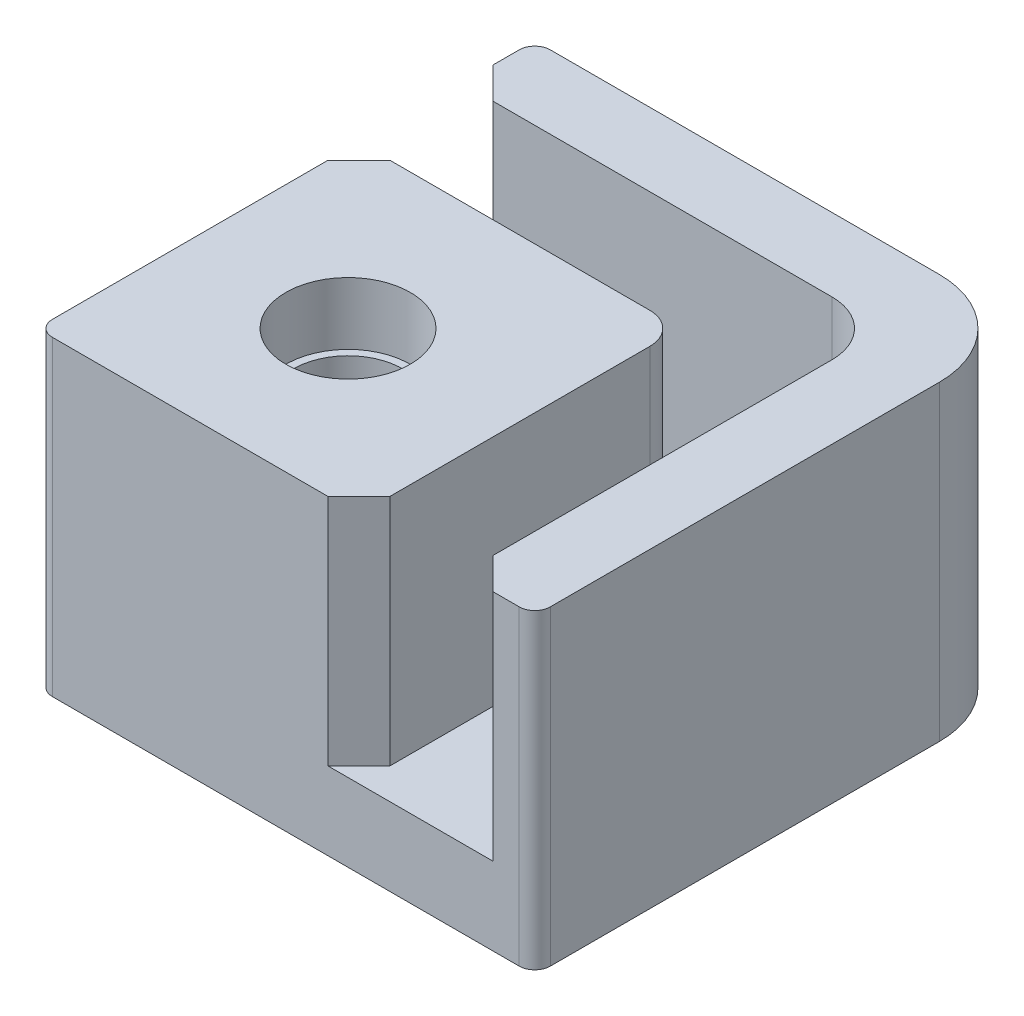
ISO-10303-21;
HEADER;
FILE_DESCRIPTION(('STEP AP214'),'2;1');
FILE_NAME('part.step','',(''),(''),'','','');
FILE_SCHEMA(('AUTOMOTIVE_DESIGN { 1 0 10303 214 1 1 1 1 }'));
ENDSEC;
DATA;
#1=APPLICATION_CONTEXT('core data for automotive mechanical design processes');
#2=APPLICATION_PROTOCOL_DEFINITION('international standard','automotive_design',2000,#1);
#3=PRODUCT_CONTEXT('',#1,'mechanical');
#4=PRODUCT('Part','Part','',(#3));
#5=PRODUCT_RELATED_PRODUCT_CATEGORY('part','',(#4));
#6=PRODUCT_DEFINITION_FORMATION('','',#4);
#7=PRODUCT_DEFINITION_CONTEXT('part definition',#1,'design');
#8=PRODUCT_DEFINITION('design','',#6,#7);
#9=PRODUCT_DEFINITION_SHAPE('','',#8);
#10=(LENGTH_UNIT() NAMED_UNIT(*) SI_UNIT(.MILLI.,.METRE.));
#11=(NAMED_UNIT(*) PLANE_ANGLE_UNIT() SI_UNIT($,.RADIAN.));
#12=(NAMED_UNIT(*) SI_UNIT($,.STERADIAN.) SOLID_ANGLE_UNIT());
#13=UNCERTAINTY_MEASURE_WITH_UNIT(LENGTH_MEASURE(1.E-05),#10,'distance_accuracy_value','');
#14=(GEOMETRIC_REPRESENTATION_CONTEXT(3) GLOBAL_UNCERTAINTY_ASSIGNED_CONTEXT((#13)) GLOBAL_UNIT_ASSIGNED_CONTEXT((#10,
#11,#12)) REPRESENTATION_CONTEXT('',''));
#15=CARTESIAN_POINT('',(0.,0.,0.));
#16=DIRECTION('',(0.,0.,1.));
#17=DIRECTION('',(1.,0.,0.));
#18=AXIS2_PLACEMENT_3D('',#15,#16,#17);
#19=CARTESIAN_POINT('',(5.,0.,11.));
#20=DIRECTION('',(0.,1.,0.));
#21=DIRECTION('',(0.,0.,1.));
#22=AXIS2_PLACEMENT_3D('',#19,#20,#21);
#23=CYLINDRICAL_SURFACE('',#22,1.75);
#24=CARTESIAN_POINT('',(5.,0.,11.));
#25=DIRECTION('',(0.,1.,0.));
#26=DIRECTION('',(0.,0.,1.));
#27=AXIS2_PLACEMENT_3D('',#24,#25,#26);
#28=CIRCLE('',#27,1.75);
#29=CARTESIAN_POINT('',(5.,0.,12.75));
#30=VERTEX_POINT('',#29);
#31=EDGE_CURVE('E212',#30,#30,#28,.T.);
#32=ORIENTED_EDGE('',*,*,#31,.F.);
#33=EDGE_LOOP('',(#32));
#34=FACE_BOUND('',#33,.T.);
#35=CARTESIAN_POINT('',(5.,8.,11.));
#36=DIRECTION('',(0.,1.,0.));
#37=DIRECTION('',(0.,0.,1.));
#38=AXIS2_PLACEMENT_3D('',#35,#36,#37);
#39=CIRCLE('',#38,1.75);
#40=CARTESIAN_POINT('',(5.,8.,12.75));
#41=VERTEX_POINT('',#40);
#42=EDGE_CURVE('E40',#41,#41,#39,.F.);
#43=ORIENTED_EDGE('',*,*,#42,.F.);
#44=EDGE_LOOP('',(#43));
#45=FACE_BOUND('',#44,.T.);
#46=ADVANCED_FACE('F36',(#34,#45),#23,.F.);
#47=CARTESIAN_POINT('',(0.,10.,16.));
#48=DIRECTION('',(0.,1.,0.));
#49=DIRECTION('',(0.,0.,1.));
#50=AXIS2_PLACEMENT_3D('',#47,#48,#49);
#51=PLANE('',#50);
#52=DIRECTION('',(1.,0.,0.));
#53=VECTOR('',#52,1.);
#54=CARTESIAN_POINT('',(0.,10.,16.));
#55=LINE('',#54,#53);
#56=CARTESIAN_POINT('',(14.65,10.,16.));
#57=VERTEX_POINT('',#56);
#58=CARTESIAN_POINT('',(15.5,10.,16.));
#59=VERTEX_POINT('',#58);
#60=EDGE_CURVE('E219',#57,#59,#55,.T.);
#61=ORIENTED_EDGE('',*,*,#60,.T.);
#62=CARTESIAN_POINT('',(15.5,10.,15.5));
#63=DIRECTION('',(0.,1.,0.));
#64=DIRECTION('',(0.,0.,1.));
#65=AXIS2_PLACEMENT_3D('',#62,#63,#64);
#66=CIRCLE('',#65,0.5);
#67=CARTESIAN_POINT('',(16.,10.,15.5));
#68=VERTEX_POINT('',#67);
#69=EDGE_CURVE('E314',#59,#68,#66,.T.);
#70=ORIENTED_EDGE('',*,*,#69,.T.);
#71=DIRECTION('',(0.,0.,-1.));
#72=VECTOR('',#71,1.);
#73=CARTESIAN_POINT('',(16.,10.,0.));
#74=LINE('',#73,#72);
#75=CARTESIAN_POINT('',(16.,10.,3.));
#76=VERTEX_POINT('',#75);
#77=EDGE_CURVE('E223',#68,#76,#74,.T.);
#78=ORIENTED_EDGE('',*,*,#77,.T.);
#79=CARTESIAN_POINT('',(13.,10.,3.));
#80=DIRECTION('',(0.,1.,0.));
#81=DIRECTION('',(0.,0.,1.));
#82=AXIS2_PLACEMENT_3D('',#79,#80,#81);
#83=CIRCLE('',#82,3.);
#84=CARTESIAN_POINT('',(13.,10.,0.));
#85=VERTEX_POINT('',#84);
#86=EDGE_CURVE('E258',#76,#85,#83,.T.);
#87=ORIENTED_EDGE('',*,*,#86,.T.);
#88=DIRECTION('',(-1.,0.,0.));
#89=VECTOR('',#88,1.);
#90=CARTESIAN_POINT('',(0.,10.,0.));
#91=LINE('',#90,#89);
#92=CARTESIAN_POINT('',(0.5,10.,0.));
#93=VERTEX_POINT('',#92);
#94=EDGE_CURVE('E196',#85,#93,#91,.T.);
#95=ORIENTED_EDGE('',*,*,#94,.T.);
#96=CARTESIAN_POINT('',(0.5,10.,0.5));
#97=DIRECTION('',(0.,1.,0.));
#98=DIRECTION('',(0.,0.,1.));
#99=AXIS2_PLACEMENT_3D('',#96,#97,#98);
#100=CIRCLE('',#99,0.5);
#101=CARTESIAN_POINT('',(0.,10.,0.5));
#102=VERTEX_POINT('',#101);
#103=EDGE_CURVE('E60',#93,#102,#100,.T.);
#104=ORIENTED_EDGE('',*,*,#103,.T.);
#105=DIRECTION('',(0.,0.,1.));
#106=VECTOR('',#105,1.);
#107=CARTESIAN_POINT('',(0.,10.,0.));
#108=LINE('',#107,#106);
#109=CARTESIAN_POINT('',(0.,10.,1.35000000000001));
#110=VERTEX_POINT('',#109);
#111=EDGE_CURVE('E217',#102,#110,#108,.T.);
#112=ORIENTED_EDGE('',*,*,#111,.T.);
#113=DIRECTION('',(-0.70710678118655,0.,-0.707106781186545));
#114=VECTOR('',#113,1.);
#115=CARTESIAN_POINT('',(7.325,10.,8.67499999999995));
#116=LINE('',#115,#114);
#117=CARTESIAN_POINT('',(1.,10.,2.35));
#118=VERTEX_POINT('',#117);
#119=EDGE_CURVE('E274',#110,#118,#116,.F.);
#120=ORIENTED_EDGE('',*,*,#119,.T.);
#121=DIRECTION('',(-1.,0.,0.));
#122=VECTOR('',#121,1.);
#123=CARTESIAN_POINT('',(0.,10.,2.35));
#124=LINE('',#123,#122);
#125=CARTESIAN_POINT('',(11.9,10.,2.35));
#126=VERTEX_POINT('',#125);
#127=EDGE_CURVE('E204',#126,#118,#124,.T.);
#128=ORIENTED_EDGE('',*,*,#127,.F.);
#129=CARTESIAN_POINT('',(11.9,10.,4.1));
#130=DIRECTION('',(0.,1.,0.));
#131=DIRECTION('',(0.,0.,1.));
#132=AXIS2_PLACEMENT_3D('',#129,#130,#131);
#133=CIRCLE('',#132,1.75);
#134=CARTESIAN_POINT('',(13.65,10.,4.1));
#135=VERTEX_POINT('',#134);
#136=EDGE_CURVE('E246',#126,#135,#133,.F.);
#137=ORIENTED_EDGE('',*,*,#136,.T.);
#138=DIRECTION('',(0.,0.,-1.));
#139=VECTOR('',#138,1.);
#140=CARTESIAN_POINT('',(13.65,10.,16.));
#141=LINE('',#140,#139);
#142=CARTESIAN_POINT('',(13.65,10.,15.));
#143=VERTEX_POINT('',#142);
#144=EDGE_CURVE('E201',#143,#135,#141,.T.);
#145=ORIENTED_EDGE('',*,*,#144,.F.);
#146=DIRECTION('',(-0.70710678118655,0.,-0.707106781186545));
#147=VECTOR('',#146,1.);
#148=CARTESIAN_POINT('',(7.32499999999995,10.,8.675));
#149=LINE('',#148,#147);
#150=EDGE_CURVE('E276',#143,#57,#149,.F.);
#151=ORIENTED_EDGE('',*,*,#150,.T.);
#152=EDGE_LOOP('',(#61,#70,#78,#87,#95,#104,#112,#120,#128,#137,#145,#151));
#153=FACE_BOUND('',#152,.T.);
#154=ADVANCED_FACE('F357',(#153),#51,.T.);
#155=CARTESIAN_POINT('',(0.,10.,0.));
#156=DIRECTION('',(1.,0.,0.));
#157=DIRECTION('',(0.,0.,-1.));
#158=AXIS2_PLACEMENT_3D('',#155,#156,#157);
#159=PLANE('',#158);
#160=DIRECTION('',(0.,0.,1.));
#161=VECTOR('',#160,1.);
#162=CARTESIAN_POINT('',(0.,0.,0.));
#163=LINE('',#162,#161);
#164=CARTESIAN_POINT('',(0.,0.,0.5));
#165=VERTEX_POINT('',#164);
#166=CARTESIAN_POINT('',(0.,0.,15.5));
#167=VERTEX_POINT('',#166);
#168=EDGE_CURVE('E215',#165,#167,#163,.T.);
#169=ORIENTED_EDGE('',*,*,#168,.T.);
#170=DIRECTION('',(0.,-1.,0.));
#171=VECTOR('',#170,1.);
#172=CARTESIAN_POINT('',(0.,10.,15.5));
#173=LINE('',#172,#171);
#174=CARTESIAN_POINT('',(0.,10.,15.5));
#175=VERTEX_POINT('',#174);
#176=EDGE_CURVE('E52',#167,#175,#173,.F.);
#177=ORIENTED_EDGE('',*,*,#176,.T.);
#178=CARTESIAN_POINT('',(0.,10.,6.65));
#179=VERTEX_POINT('',#178);
#180=EDGE_CURVE('E220',#179,#175,#108,.T.);
#181=ORIENTED_EDGE('',*,*,#180,.F.);
#182=DIRECTION('',(0.,-1.,0.));
#183=VECTOR('',#182,1.);
#184=CARTESIAN_POINT('',(0.,10.,6.65));
#185=LINE('',#184,#183);
#186=CARTESIAN_POINT('',(0.,2.5,6.65));
#187=VERTEX_POINT('',#186);
#188=EDGE_CURVE('E284',#179,#187,#185,.T.);
#189=ORIENTED_EDGE('',*,*,#188,.T.);
#190=DIRECTION('',(0.,0.,1.));
#191=VECTOR('',#190,1.);
#192=CARTESIAN_POINT('',(0.,2.5,2.35));
#193=LINE('',#192,#191);
#194=CARTESIAN_POINT('',(0.,2.5,1.35000000000001));
#195=VERTEX_POINT('',#194);
#196=EDGE_CURVE('E211',#195,#187,#193,.T.);
#197=ORIENTED_EDGE('',*,*,#196,.F.);
#198=DIRECTION('',(0.,1.,0.));
#199=VECTOR('',#198,1.);
#200=CARTESIAN_POINT('',(0.,10.,1.35000000000001));
#201=LINE('',#200,#199);
#202=EDGE_CURVE('E281',#195,#110,#201,.T.);
#203=ORIENTED_EDGE('',*,*,#202,.T.);
#204=ORIENTED_EDGE('',*,*,#111,.F.);
#205=DIRECTION('',(0.,-1.,0.));
#206=VECTOR('',#205,1.);
#207=CARTESIAN_POINT('',(0.,10.,0.5));
#208=LINE('',#207,#206);
#209=EDGE_CURVE('E316',#102,#165,#208,.T.);
#210=ORIENTED_EDGE('',*,*,#209,.T.);
#211=EDGE_LOOP('',(#169,#177,#181,#189,#197,#203,#204,#210));
#212=FACE_BOUND('',#211,.T.);
#213=ADVANCED_FACE('F333',(#212),#159,.F.);
#214=CARTESIAN_POINT('',(0.,10.,16.));
#215=DIRECTION('',(0.,0.,-1.));
#216=DIRECTION('',(-1.,0.,0.));
#217=AXIS2_PLACEMENT_3D('',#214,#215,#216);
#218=PLANE('',#217);
#219=DIRECTION('',(1.,0.,0.));
#220=VECTOR('',#219,1.);
#221=CARTESIAN_POINT('',(0.,0.,16.));
#222=LINE('',#221,#220);
#223=CARTESIAN_POINT('',(0.500000000000002,0.,16.));
#224=VERTEX_POINT('',#223);
#225=CARTESIAN_POINT('',(15.5,0.,16.));
#226=VERTEX_POINT('',#225);
#227=EDGE_CURVE('E227',#224,#226,#222,.T.);
#228=ORIENTED_EDGE('',*,*,#227,.T.);
#229=DIRECTION('',(0.,-1.,0.));
#230=VECTOR('',#229,1.);
#231=CARTESIAN_POINT('',(15.5,10.,16.));
#232=LINE('',#231,#230);
#233=EDGE_CURVE('E311',#226,#59,#232,.F.);
#234=ORIENTED_EDGE('',*,*,#233,.T.);
#235=ORIENTED_EDGE('',*,*,#60,.F.);
#236=DIRECTION('',(0.,-1.,0.));
#237=VECTOR('',#236,1.);
#238=CARTESIAN_POINT('',(14.65,10.,16.));
#239=LINE('',#238,#237);
#240=CARTESIAN_POINT('',(14.65,2.5,16.));
#241=VERTEX_POINT('',#240);
#242=EDGE_CURVE('E260',#57,#241,#239,.T.);
#243=ORIENTED_EDGE('',*,*,#242,.T.);
#244=DIRECTION('',(1.,0.,0.));
#245=VECTOR('',#244,1.);
#246=CARTESIAN_POINT('',(13.65,2.5,16.));
#247=LINE('',#246,#245);
#248=CARTESIAN_POINT('',(9.35,2.5,16.));
#249=VERTEX_POINT('',#248);
#250=EDGE_CURVE('E370',#249,#241,#247,.T.);
#251=ORIENTED_EDGE('',*,*,#250,.F.);
#252=DIRECTION('',(0.,1.,0.));
#253=VECTOR('',#252,1.);
#254=CARTESIAN_POINT('',(9.35,10.,16.));
#255=LINE('',#254,#253);
#256=CARTESIAN_POINT('',(9.35,10.,16.));
#257=VERTEX_POINT('',#256);
#258=EDGE_CURVE('E263',#249,#257,#255,.T.);
#259=ORIENTED_EDGE('',*,*,#258,.T.);
#260=CARTESIAN_POINT('',(0.500000000000002,10.,16.));
#261=VERTEX_POINT('',#260);
#262=EDGE_CURVE('E221',#261,#257,#55,.T.);
#263=ORIENTED_EDGE('',*,*,#262,.F.);
#264=DIRECTION('',(0.,-1.,0.));
#265=VECTOR('',#264,1.);
#266=CARTESIAN_POINT('',(0.500000000000002,10.,16.));
#267=LINE('',#266,#265);
#268=EDGE_CURVE('E308',#261,#224,#267,.T.);
#269=ORIENTED_EDGE('',*,*,#268,.T.);
#270=EDGE_LOOP('',(#228,#234,#235,#243,#251,#259,#263,#269));
#271=FACE_BOUND('',#270,.T.);
#272=ADVANCED_FACE('F325',(#271),#218,.F.);
#273=CARTESIAN_POINT('',(16.,10.,0.));
#274=DIRECTION('',(-1.,0.,0.));
#275=DIRECTION('',(0.,0.,1.));
#276=AXIS2_PLACEMENT_3D('',#273,#274,#275);
#277=PLANE('',#276);
#278=ORIENTED_EDGE('',*,*,#77,.F.);
#279=DIRECTION('',(0.,-1.,0.));
#280=VECTOR('',#279,1.);
#281=CARTESIAN_POINT('',(16.,10.,15.5));
#282=LINE('',#281,#280);
#283=CARTESIAN_POINT('',(16.,0.,15.5));
#284=VERTEX_POINT('',#283);
#285=EDGE_CURVE('E299',#68,#284,#282,.T.);
#286=ORIENTED_EDGE('',*,*,#285,.T.);
#287=DIRECTION('',(0.,0.,-1.));
#288=VECTOR('',#287,1.);
#289=CARTESIAN_POINT('',(16.,0.,0.));
#290=LINE('',#289,#288);
#291=CARTESIAN_POINT('',(16.,0.,3.));
#292=VERTEX_POINT('',#291);
#293=EDGE_CURVE('E230',#284,#292,#290,.T.);
#294=ORIENTED_EDGE('',*,*,#293,.T.);
#295=DIRECTION('',(0.,-1.,0.));
#296=VECTOR('',#295,1.);
#297=CARTESIAN_POINT('',(16.,10.,3.));
#298=LINE('',#297,#296);
#299=EDGE_CURVE('E255',#292,#76,#298,.F.);
#300=ORIENTED_EDGE('',*,*,#299,.T.);
#301=EDGE_LOOP('',(#278,#286,#294,#300));
#302=FACE_BOUND('',#301,.T.);
#303=ADVANCED_FACE('F348',(#302),#277,.F.);
#304=CARTESIAN_POINT('',(0.,10.,0.));
#305=DIRECTION('',(0.,0.,1.));
#306=DIRECTION('',(1.,0.,0.));
#307=AXIS2_PLACEMENT_3D('',#304,#305,#306);
#308=PLANE('',#307);
#309=DIRECTION('',(-1.,0.,0.));
#310=VECTOR('',#309,1.);
#311=CARTESIAN_POINT('',(0.,0.,0.));
#312=LINE('',#311,#310);
#313=CARTESIAN_POINT('',(13.,0.,0.));
#314=VERTEX_POINT('',#313);
#315=CARTESIAN_POINT('',(0.5,0.,0.));
#316=VERTEX_POINT('',#315);
#317=EDGE_CURVE('E232',#314,#316,#312,.T.);
#318=ORIENTED_EDGE('',*,*,#317,.T.);
#319=DIRECTION('',(0.,-1.,0.));
#320=VECTOR('',#319,1.);
#321=CARTESIAN_POINT('',(0.5,10.,0.));
#322=LINE('',#321,#320);
#323=EDGE_CURVE('E11',#316,#93,#322,.F.);
#324=ORIENTED_EDGE('',*,*,#323,.T.);
#325=ORIENTED_EDGE('',*,*,#94,.F.);
#326=DIRECTION('',(0.,-1.,0.));
#327=VECTOR('',#326,1.);
#328=CARTESIAN_POINT('',(13.,10.,0.));
#329=LINE('',#328,#327);
#330=EDGE_CURVE('E249',#85,#314,#329,.T.);
#331=ORIENTED_EDGE('',*,*,#330,.T.);
#332=EDGE_LOOP('',(#318,#324,#325,#331));
#333=FACE_BOUND('',#332,.T.);
#334=ADVANCED_FACE('F339',(#333),#308,.F.);
#335=CARTESIAN_POINT('',(5.,10.,11.));
#336=DIRECTION('',(0.,1.,0.));
#337=DIRECTION('',(0.,0.,1.));
#338=AXIS2_PLACEMENT_3D('',#335,#336,#337);
#339=CIRCLE('',#338,2.);
#340=CARTESIAN_POINT('',(5.,10.,13.));
#341=VERTEX_POINT('',#340);
#342=EDGE_CURVE('E379',#341,#341,#339,.T.);
#343=ORIENTED_EDGE('',*,*,#342,.F.);
#344=EDGE_LOOP('',(#343));
#345=FACE_BOUND('',#344,.T.);
#346=ORIENTED_EDGE('',*,*,#180,.T.);
#347=CARTESIAN_POINT('',(0.500000000000002,10.,15.5));
#348=DIRECTION('',(0.,1.,0.));
#349=DIRECTION('',(0.,0.,1.));
#350=AXIS2_PLACEMENT_3D('',#347,#348,#349);
#351=CIRCLE('',#350,0.5);
#352=EDGE_CURVE('E45',#175,#261,#351,.T.);
#353=ORIENTED_EDGE('',*,*,#352,.T.);
#354=ORIENTED_EDGE('',*,*,#262,.T.);
#355=DIRECTION('',(-0.707106781186546,0.,0.707106781186549));
#356=VECTOR('',#355,1.);
#357=CARTESIAN_POINT('',(4.67500000000002,10.,20.675));
#358=LINE('',#357,#356);
#359=CARTESIAN_POINT('',(10.35,10.,15.));
#360=VERTEX_POINT('',#359);
#361=EDGE_CURVE('E200',#257,#360,#358,.F.);
#362=ORIENTED_EDGE('',*,*,#361,.T.);
#363=DIRECTION('',(0.,0.,1.));
#364=VECTOR('',#363,1.);
#365=CARTESIAN_POINT('',(10.35,10.,16.));
#366=LINE('',#365,#364);
#367=CARTESIAN_POINT('',(10.35,10.,6.65));
#368=VERTEX_POINT('',#367);
#369=EDGE_CURVE('E192',#368,#360,#366,.T.);
#370=ORIENTED_EDGE('',*,*,#369,.F.);
#371=CARTESIAN_POINT('',(9.35,10.,6.65));
#372=DIRECTION('',(0.,1.,0.));
#373=DIRECTION('',(0.,0.,1.));
#374=AXIS2_PLACEMENT_3D('',#371,#372,#373);
#375=CIRCLE('',#374,1.);
#376=CARTESIAN_POINT('',(9.35,10.,5.65));
#377=VERTEX_POINT('',#376);
#378=EDGE_CURVE('E177',#368,#377,#375,.T.);
#379=ORIENTED_EDGE('',*,*,#378,.T.);
#380=DIRECTION('',(1.,0.,0.));
#381=VECTOR('',#380,1.);
#382=CARTESIAN_POINT('',(0.,10.,5.65));
#383=LINE('',#382,#381);
#384=CARTESIAN_POINT('',(1.,10.,5.65));
#385=VERTEX_POINT('',#384);
#386=EDGE_CURVE('E202',#385,#377,#383,.T.);
#387=ORIENTED_EDGE('',*,*,#386,.F.);
#388=DIRECTION('',(0.707106781186546,0.,-0.707106781186549));
#389=VECTOR('',#388,1.);
#390=CARTESIAN_POINT('',(-4.675,10.,11.325));
#391=LINE('',#390,#389);
#392=EDGE_CURVE('E266',#385,#179,#391,.F.);
#393=ORIENTED_EDGE('',*,*,#392,.T.);
#394=EDGE_LOOP('',(#346,#353,#354,#362,#370,#379,#387,#393));
#395=FACE_BOUND('',#394,.T.);
#396=ADVANCED_FACE('F198',(#345,#395),#51,.T.);
#397=CARTESIAN_POINT('',(0.,0.,16.));
#398=DIRECTION('',(0.,1.,0.));
#399=DIRECTION('',(0.,0.,1.));
#400=AXIS2_PLACEMENT_3D('',#397,#398,#399);
#401=PLANE('',#400);
#402=ORIENTED_EDGE('',*,*,#31,.T.);
#403=EDGE_LOOP('',(#402));
#404=FACE_BOUND('',#403,.T.);
#405=ORIENTED_EDGE('',*,*,#293,.F.);
#406=CARTESIAN_POINT('',(15.5,0.,15.5));
#407=DIRECTION('',(0.,1.,0.));
#408=DIRECTION('',(0.,0.,1.));
#409=AXIS2_PLACEMENT_3D('',#406,#407,#408);
#410=CIRCLE('',#409,0.5);
#411=EDGE_CURVE('E306',#284,#226,#410,.F.);
#412=ORIENTED_EDGE('',*,*,#411,.T.);
#413=ORIENTED_EDGE('',*,*,#227,.F.);
#414=CARTESIAN_POINT('',(0.500000000000002,0.,15.5));
#415=DIRECTION('',(0.,1.,0.));
#416=DIRECTION('',(0.,0.,1.));
#417=AXIS2_PLACEMENT_3D('',#414,#415,#416);
#418=CIRCLE('',#417,0.5);
#419=EDGE_CURVE('E304',#224,#167,#418,.F.);
#420=ORIENTED_EDGE('',*,*,#419,.T.);
#421=ORIENTED_EDGE('',*,*,#168,.F.);
#422=CARTESIAN_POINT('',(0.5,0.,0.5));
#423=DIRECTION('',(0.,1.,0.));
#424=DIRECTION('',(0.,0.,1.));
#425=AXIS2_PLACEMENT_3D('',#422,#423,#424);
#426=CIRCLE('',#425,0.5);
#427=EDGE_CURVE('E302',#165,#316,#426,.F.);
#428=ORIENTED_EDGE('',*,*,#427,.T.);
#429=ORIENTED_EDGE('',*,*,#317,.F.);
#430=CARTESIAN_POINT('',(13.,0.,3.));
#431=DIRECTION('',(0.,1.,0.));
#432=DIRECTION('',(0.,0.,1.));
#433=AXIS2_PLACEMENT_3D('',#430,#431,#432);
#434=CIRCLE('',#433,3.);
#435=EDGE_CURVE('E252',#314,#292,#434,.F.);
#436=ORIENTED_EDGE('',*,*,#435,.T.);
#437=EDGE_LOOP('',(#405,#412,#413,#420,#421,#428,#429,#436));
#438=FACE_BOUND('',#437,.T.);
#439=ADVANCED_FACE('F332',(#404,#438),#401,.F.);
#440=CARTESIAN_POINT('',(0.,2.5,2.35));
#441=DIRECTION('',(0.,0.,-1.));
#442=DIRECTION('',(-1.,0.,0.));
#443=AXIS2_PLACEMENT_3D('',#440,#441,#442);
#444=PLANE('',#443);
#445=ORIENTED_EDGE('',*,*,#127,.T.);
#446=DIRECTION('',(0.,-1.,0.));
#447=VECTOR('',#446,1.);
#448=CARTESIAN_POINT('',(1.,2.5,2.35));
#449=LINE('',#448,#447);
#450=CARTESIAN_POINT('',(1.,2.5,2.35));
#451=VERTEX_POINT('',#450);
#452=EDGE_CURVE('E287',#118,#451,#449,.T.);
#453=ORIENTED_EDGE('',*,*,#452,.T.);
#454=DIRECTION('',(-1.,0.,0.));
#455=VECTOR('',#454,1.);
#456=CARTESIAN_POINT('',(0.,2.5,2.35));
#457=LINE('',#456,#455);
#458=CARTESIAN_POINT('',(11.9,2.5,2.35));
#459=VERTEX_POINT('',#458);
#460=EDGE_CURVE('E216',#459,#451,#457,.T.);
#461=ORIENTED_EDGE('',*,*,#460,.F.);
#462=DIRECTION('',(0.,1.,0.));
#463=VECTOR('',#462,1.);
#464=CARTESIAN_POINT('',(11.9,10.,2.35));
#465=LINE('',#464,#463);
#466=EDGE_CURVE('E238',#459,#126,#465,.T.);
#467=ORIENTED_EDGE('',*,*,#466,.T.);
#468=EDGE_LOOP('',(#445,#453,#461,#467));
#469=FACE_BOUND('',#468,.T.);
#470=ADVANCED_FACE('F407',(#469),#444,.F.);
#471=CARTESIAN_POINT('',(13.65,2.5,16.));
#472=DIRECTION('',(1.,0.,0.));
#473=DIRECTION('',(0.,0.,-1.));
#474=AXIS2_PLACEMENT_3D('',#471,#472,#473);
#475=PLANE('',#474);
#476=DIRECTION('',(0.,0.,-1.));
#477=VECTOR('',#476,1.);
#478=CARTESIAN_POINT('',(13.65,2.5,16.));
#479=LINE('',#478,#477);
#480=CARTESIAN_POINT('',(13.65,2.5,15.));
#481=VERTEX_POINT('',#480);
#482=CARTESIAN_POINT('',(13.65,2.5,4.1));
#483=VERTEX_POINT('',#482);
#484=EDGE_CURVE('E366',#481,#483,#479,.T.);
#485=ORIENTED_EDGE('',*,*,#484,.F.);
#486=DIRECTION('',(0.,1.,0.));
#487=VECTOR('',#486,1.);
#488=CARTESIAN_POINT('',(13.65,2.5,15.));
#489=LINE('',#488,#487);
#490=EDGE_CURVE('E271',#481,#143,#489,.T.);
#491=ORIENTED_EDGE('',*,*,#490,.T.);
#492=ORIENTED_EDGE('',*,*,#144,.T.);
#493=DIRECTION('',(0.,1.,0.));
#494=VECTOR('',#493,1.);
#495=CARTESIAN_POINT('',(13.65,2.5,4.1));
#496=LINE('',#495,#494);
#497=EDGE_CURVE('E241',#135,#483,#496,.F.);
#498=ORIENTED_EDGE('',*,*,#497,.T.);
#499=EDGE_LOOP('',(#485,#491,#492,#498));
#500=FACE_BOUND('',#499,.T.);
#501=ADVANCED_FACE('F365',(#500),#475,.F.);
#502=CARTESIAN_POINT('',(10.35,2.5,16.));
#503=DIRECTION('',(-1.,0.,0.));
#504=DIRECTION('',(0.,0.,1.));
#505=AXIS2_PLACEMENT_3D('',#502,#503,#504);
#506=PLANE('',#505);
#507=ORIENTED_EDGE('',*,*,#369,.T.);
#508=DIRECTION('',(0.,-1.,0.));
#509=VECTOR('',#508,1.);
#510=CARTESIAN_POINT('',(10.35,2.5,15.));
#511=LINE('',#510,#509);
#512=CARTESIAN_POINT('',(10.35,2.5,15.));
#513=VERTEX_POINT('',#512);
#514=EDGE_CURVE('E269',#360,#513,#511,.T.);
#515=ORIENTED_EDGE('',*,*,#514,.T.);
#516=DIRECTION('',(0.,0.,1.));
#517=VECTOR('',#516,1.);
#518=CARTESIAN_POINT('',(10.35,2.5,16.));
#519=LINE('',#518,#517);
#520=CARTESIAN_POINT('',(10.35,2.5,6.65));
#521=VERTEX_POINT('',#520);
#522=EDGE_CURVE('E195',#521,#513,#519,.T.);
#523=ORIENTED_EDGE('',*,*,#522,.F.);
#524=DIRECTION('',(0.,1.,0.));
#525=VECTOR('',#524,1.);
#526=CARTESIAN_POINT('',(10.35,2.5,6.65));
#527=LINE('',#526,#525);
#528=EDGE_CURVE('E181',#521,#368,#527,.T.);
#529=ORIENTED_EDGE('',*,*,#528,.T.);
#530=EDGE_LOOP('',(#507,#515,#523,#529));
#531=FACE_BOUND('',#530,.T.);
#532=ADVANCED_FACE('F191',(#531),#506,.F.);
#533=CARTESIAN_POINT('',(0.,2.5,5.65));
#534=DIRECTION('',(0.,0.,1.));
#535=DIRECTION('',(1.,0.,0.));
#536=AXIS2_PLACEMENT_3D('',#533,#534,#535);
#537=PLANE('',#536);
#538=DIRECTION('',(1.,0.,0.));
#539=VECTOR('',#538,1.);
#540=CARTESIAN_POINT('',(0.,2.5,5.65));
#541=LINE('',#540,#539);
#542=CARTESIAN_POINT('',(1.,2.5,5.65));
#543=VERTEX_POINT('',#542);
#544=CARTESIAN_POINT('',(9.35,2.5,5.65));
#545=VERTEX_POINT('',#544);
#546=EDGE_CURVE('E376',#543,#545,#541,.T.);
#547=ORIENTED_EDGE('',*,*,#546,.F.);
#548=DIRECTION('',(0.,1.,0.));
#549=VECTOR('',#548,1.);
#550=CARTESIAN_POINT('',(1.,2.5,5.65));
#551=LINE('',#550,#549);
#552=EDGE_CURVE('E278',#543,#385,#551,.T.);
#553=ORIENTED_EDGE('',*,*,#552,.T.);
#554=ORIENTED_EDGE('',*,*,#386,.T.);
#555=DIRECTION('',(0.,1.,0.));
#556=VECTOR('',#555,1.);
#557=CARTESIAN_POINT('',(9.35,2.5,5.65));
#558=LINE('',#557,#556);
#559=EDGE_CURVE('E183',#377,#545,#558,.F.);
#560=ORIENTED_EDGE('',*,*,#559,.T.);
#561=EDGE_LOOP('',(#547,#553,#554,#560));
#562=FACE_BOUND('',#561,.T.);
#563=ADVANCED_FACE('F400',(#562),#537,.F.);
#564=CARTESIAN_POINT('',(0.,2.5,5.65));
#565=DIRECTION('',(0.,1.,0.));
#566=DIRECTION('',(0.,0.,1.));
#567=AXIS2_PLACEMENT_3D('',#564,#565,#566);
#568=PLANE('',#567);
#569=ORIENTED_EDGE('',*,*,#250,.T.);
#570=DIRECTION('',(0.70710678118655,0.,0.707106781186545));
#571=VECTOR('',#570,1.);
#572=CARTESIAN_POINT('',(13.65,2.5,15.));
#573=LINE('',#572,#571);
#574=EDGE_CURVE('E292',#241,#481,#573,.F.);
#575=ORIENTED_EDGE('',*,*,#574,.T.);
#576=ORIENTED_EDGE('',*,*,#484,.T.);
#577=CARTESIAN_POINT('',(11.9,2.5,4.1));
#578=DIRECTION('',(0.,1.,0.));
#579=DIRECTION('',(0.,0.,1.));
#580=AXIS2_PLACEMENT_3D('',#577,#578,#579);
#581=CIRCLE('',#580,1.75);
#582=EDGE_CURVE('E244',#483,#459,#581,.T.);
#583=ORIENTED_EDGE('',*,*,#582,.T.);
#584=ORIENTED_EDGE('',*,*,#460,.T.);
#585=DIRECTION('',(0.70710678118655,0.,0.707106781186545));
#586=VECTOR('',#585,1.);
#587=CARTESIAN_POINT('',(0.,2.5,1.35000000000001));
#588=LINE('',#587,#586);
#589=EDGE_CURVE('E296',#451,#195,#588,.F.);
#590=ORIENTED_EDGE('',*,*,#589,.T.);
#591=ORIENTED_EDGE('',*,*,#196,.T.);
#592=DIRECTION('',(-0.707106781186546,0.,0.707106781186549));
#593=VECTOR('',#592,1.);
#594=CARTESIAN_POINT('',(1.,2.5,5.65));
#595=LINE('',#594,#593);
#596=EDGE_CURVE('E294',#187,#543,#595,.F.);
#597=ORIENTED_EDGE('',*,*,#596,.T.);
#598=ORIENTED_EDGE('',*,*,#546,.T.);
#599=CARTESIAN_POINT('',(9.35,2.5,6.65));
#600=DIRECTION('',(0.,1.,0.));
#601=DIRECTION('',(0.,0.,1.));
#602=AXIS2_PLACEMENT_3D('',#599,#600,#601);
#603=CIRCLE('',#602,1.);
#604=EDGE_CURVE('E236',#545,#521,#603,.F.);
#605=ORIENTED_EDGE('',*,*,#604,.T.);
#606=ORIENTED_EDGE('',*,*,#522,.T.);
#607=DIRECTION('',(0.707106781186546,0.,-0.707106781186549));
#608=VECTOR('',#607,1.);
#609=CARTESIAN_POINT('',(9.35,2.5,16.));
#610=LINE('',#609,#608);
#611=EDGE_CURVE('E289',#513,#249,#610,.F.);
#612=ORIENTED_EDGE('',*,*,#611,.T.);
#613=EDGE_LOOP('',(#569,#575,#576,#583,#584,#590,#591,#597,#598,#605,#606,#612));
#614=FACE_BOUND('',#613,.T.);
#615=ADVANCED_FACE('F420',(#614),#568,.T.);
#616=CARTESIAN_POINT('',(9.35,2.5,6.65));
#617=DIRECTION('',(0.,1.,0.));
#618=DIRECTION('',(0.,0.,1.));
#619=AXIS2_PLACEMENT_3D('',#616,#617,#618);
#620=CYLINDRICAL_SURFACE('',#619,1.);
#621=ORIENTED_EDGE('',*,*,#604,.F.);
#622=ORIENTED_EDGE('',*,*,#559,.F.);
#623=ORIENTED_EDGE('',*,*,#378,.F.);
#624=ORIENTED_EDGE('',*,*,#528,.F.);
#625=EDGE_LOOP('',(#621,#622,#623,#624));
#626=FACE_BOUND('',#625,.T.);
#627=ADVANCED_FACE('F180',(#626),#620,.T.);
#628=CARTESIAN_POINT('',(11.9,2.5,4.1));
#629=DIRECTION('',(0.,-1.,0.));
#630=DIRECTION('',(0.,0.,-1.));
#631=AXIS2_PLACEMENT_3D('',#628,#629,#630);
#632=CYLINDRICAL_SURFACE('',#631,1.75);
#633=ORIENTED_EDGE('',*,*,#582,.F.);
#634=ORIENTED_EDGE('',*,*,#497,.F.);
#635=ORIENTED_EDGE('',*,*,#136,.F.);
#636=ORIENTED_EDGE('',*,*,#466,.F.);
#637=EDGE_LOOP('',(#633,#634,#635,#636));
#638=FACE_BOUND('',#637,.T.);
#639=ADVANCED_FACE('F419',(#638),#632,.F.);
#640=CARTESIAN_POINT('',(13.,10.,3.));
#641=DIRECTION('',(0.,-1.,0.));
#642=DIRECTION('',(0.,0.,-1.));
#643=AXIS2_PLACEMENT_3D('',#640,#641,#642);
#644=CYLINDRICAL_SURFACE('',#643,3.);
#645=ORIENTED_EDGE('',*,*,#86,.F.);
#646=ORIENTED_EDGE('',*,*,#299,.F.);
#647=ORIENTED_EDGE('',*,*,#435,.F.);
#648=ORIENTED_EDGE('',*,*,#330,.F.);
#649=EDGE_LOOP('',(#645,#646,#647,#648));
#650=FACE_BOUND('',#649,.T.);
#651=ADVANCED_FACE('F344',(#650),#644,.T.);
#652=CARTESIAN_POINT('',(9.35,10.,16.));
#653=DIRECTION('',(-0.707106781186549,0.,-0.707106781186546));
#654=DIRECTION('',(-0.707106781186546,0.,0.707106781186549));
#655=AXIS2_PLACEMENT_3D('',#652,#653,#654);
#656=PLANE('',#655);
#657=ORIENTED_EDGE('',*,*,#611,.F.);
#658=ORIENTED_EDGE('',*,*,#514,.F.);
#659=ORIENTED_EDGE('',*,*,#361,.F.);
#660=ORIENTED_EDGE('',*,*,#258,.F.);
#661=EDGE_LOOP('',(#657,#658,#659,#660));
#662=FACE_BOUND('',#661,.T.);
#663=ADVANCED_FACE('F426',(#662),#656,.F.);
#664=CARTESIAN_POINT('',(13.65,2.5,15.));
#665=DIRECTION('',(0.707106781186545,0.,-0.70710678118655));
#666=DIRECTION('',(-0.70710678118655,0.,-0.707106781186545));
#667=AXIS2_PLACEMENT_3D('',#664,#665,#666);
#668=PLANE('',#667);
#669=ORIENTED_EDGE('',*,*,#574,.F.);
#670=ORIENTED_EDGE('',*,*,#242,.F.);
#671=ORIENTED_EDGE('',*,*,#150,.F.);
#672=ORIENTED_EDGE('',*,*,#490,.F.);
#673=EDGE_LOOP('',(#669,#670,#671,#672));
#674=FACE_BOUND('',#673,.T.);
#675=ADVANCED_FACE('F362',(#674),#668,.F.);
#676=CARTESIAN_POINT('',(1.,2.5,5.65));
#677=DIRECTION('',(0.707106781186549,0.,0.707106781186546));
#678=DIRECTION('',(0.707106781186546,0.,-0.707106781186549));
#679=AXIS2_PLACEMENT_3D('',#676,#677,#678);
#680=PLANE('',#679);
#681=ORIENTED_EDGE('',*,*,#596,.F.);
#682=ORIENTED_EDGE('',*,*,#188,.F.);
#683=ORIENTED_EDGE('',*,*,#392,.F.);
#684=ORIENTED_EDGE('',*,*,#552,.F.);
#685=EDGE_LOOP('',(#681,#682,#683,#684));
#686=FACE_BOUND('',#685,.T.);
#687=ADVANCED_FACE('F432',(#686),#680,.F.);
#688=CARTESIAN_POINT('',(0.,10.,1.35000000000001));
#689=DIRECTION('',(0.707106781186545,0.,-0.70710678118655));
#690=DIRECTION('',(-0.70710678118655,0.,-0.707106781186545));
#691=AXIS2_PLACEMENT_3D('',#688,#689,#690);
#692=PLANE('',#691);
#693=ORIENTED_EDGE('',*,*,#589,.F.);
#694=ORIENTED_EDGE('',*,*,#452,.F.);
#695=ORIENTED_EDGE('',*,*,#119,.F.);
#696=ORIENTED_EDGE('',*,*,#202,.F.);
#697=EDGE_LOOP('',(#693,#694,#695,#696));
#698=FACE_BOUND('',#697,.T.);
#699=ADVANCED_FACE('F435',(#698),#692,.F.);
#700=CARTESIAN_POINT('',(15.5,10.,15.5));
#701=DIRECTION('',(0.,-1.,0.));
#702=DIRECTION('',(0.,0.,-1.));
#703=AXIS2_PLACEMENT_3D('',#700,#701,#702);
#704=CYLINDRICAL_SURFACE('',#703,0.5);
#705=ORIENTED_EDGE('',*,*,#69,.F.);
#706=ORIENTED_EDGE('',*,*,#233,.F.);
#707=ORIENTED_EDGE('',*,*,#411,.F.);
#708=ORIENTED_EDGE('',*,*,#285,.F.);
#709=EDGE_LOOP('',(#705,#706,#707,#708));
#710=FACE_BOUND('',#709,.T.);
#711=ADVANCED_FACE('F352',(#710),#704,.T.);
#712=CARTESIAN_POINT('',(0.500000000000002,10.,15.5));
#713=DIRECTION('',(0.,-1.,0.));
#714=DIRECTION('',(0.,0.,-1.));
#715=AXIS2_PLACEMENT_3D('',#712,#713,#714);
#716=CYLINDRICAL_SURFACE('',#715,0.5);
#717=ORIENTED_EDGE('',*,*,#352,.F.);
#718=ORIENTED_EDGE('',*,*,#176,.F.);
#719=ORIENTED_EDGE('',*,*,#419,.F.);
#720=ORIENTED_EDGE('',*,*,#268,.F.);
#721=EDGE_LOOP('',(#717,#718,#719,#720));
#722=FACE_BOUND('',#721,.T.);
#723=ADVANCED_FACE('F328',(#722),#716,.T.);
#724=CARTESIAN_POINT('',(0.5,10.,0.5));
#725=DIRECTION('',(0.,-1.,0.));
#726=DIRECTION('',(0.,0.,-1.));
#727=AXIS2_PLACEMENT_3D('',#724,#725,#726);
#728=CYLINDRICAL_SURFACE('',#727,0.5);
#729=ORIENTED_EDGE('',*,*,#103,.F.);
#730=ORIENTED_EDGE('',*,*,#323,.F.);
#731=ORIENTED_EDGE('',*,*,#427,.F.);
#732=ORIENTED_EDGE('',*,*,#209,.F.);
#733=EDGE_LOOP('',(#729,#730,#731,#732));
#734=FACE_BOUND('',#733,.T.);
#735=ADVANCED_FACE('F38',(#734),#728,.T.);
#736=CARTESIAN_POINT('',(5.,8.,11.));
#737=DIRECTION('',(0.,1.,0.));
#738=DIRECTION('',(0.,0.,1.));
#739=AXIS2_PLACEMENT_3D('',#736,#737,#738);
#740=PLANE('',#739);
#741=CARTESIAN_POINT('',(5.,8.,11.));
#742=DIRECTION('',(0.,1.,0.));
#743=DIRECTION('',(0.,0.,1.));
#744=AXIS2_PLACEMENT_3D('',#741,#742,#743);
#745=CIRCLE('',#744,2.);
#746=CARTESIAN_POINT('',(5.,8.,13.));
#747=VERTEX_POINT('',#746);
#748=EDGE_CURVE('E382',#747,#747,#745,.T.);
#749=ORIENTED_EDGE('',*,*,#748,.T.);
#750=EDGE_LOOP('',(#749));
#751=FACE_BOUND('',#750,.T.);
#752=ORIENTED_EDGE('',*,*,#42,.T.);
#753=EDGE_LOOP('',(#752));
#754=FACE_BOUND('',#753,.T.);
#755=ADVANCED_FACE('F389',(#751,#754),#740,.T.);
#756=CARTESIAN_POINT('',(5.,8.,11.));
#757=DIRECTION('',(0.,1.,0.));
#758=DIRECTION('',(0.,0.,1.));
#759=AXIS2_PLACEMENT_3D('',#756,#757,#758);
#760=CYLINDRICAL_SURFACE('',#759,2.);
#761=ORIENTED_EDGE('',*,*,#748,.F.);
#762=EDGE_LOOP('',(#761));
#763=FACE_BOUND('',#762,.T.);
#764=ORIENTED_EDGE('',*,*,#342,.T.);
#765=EDGE_LOOP('',(#764));
#766=FACE_BOUND('',#765,.T.);
#767=ADVANCED_FACE('F448',(#763,#766),#760,.F.);
#768=CLOSED_SHELL('',(#46,#154,#213,#272,#303,#334,#396,#439,#470,#501,#532,#563,#615,#627,#639,
#651,#663,#675,#687,#699,#711,#723,#735,#755,#767));
#769=MANIFOLD_SOLID_BREP('B2',#768);
#770=ADVANCED_BREP_SHAPE_REPRESENTATION('',(#18,#769),#14);
#771=SHAPE_DEFINITION_REPRESENTATION(#9,#770);
ENDSEC;
END-ISO-10303-21;
